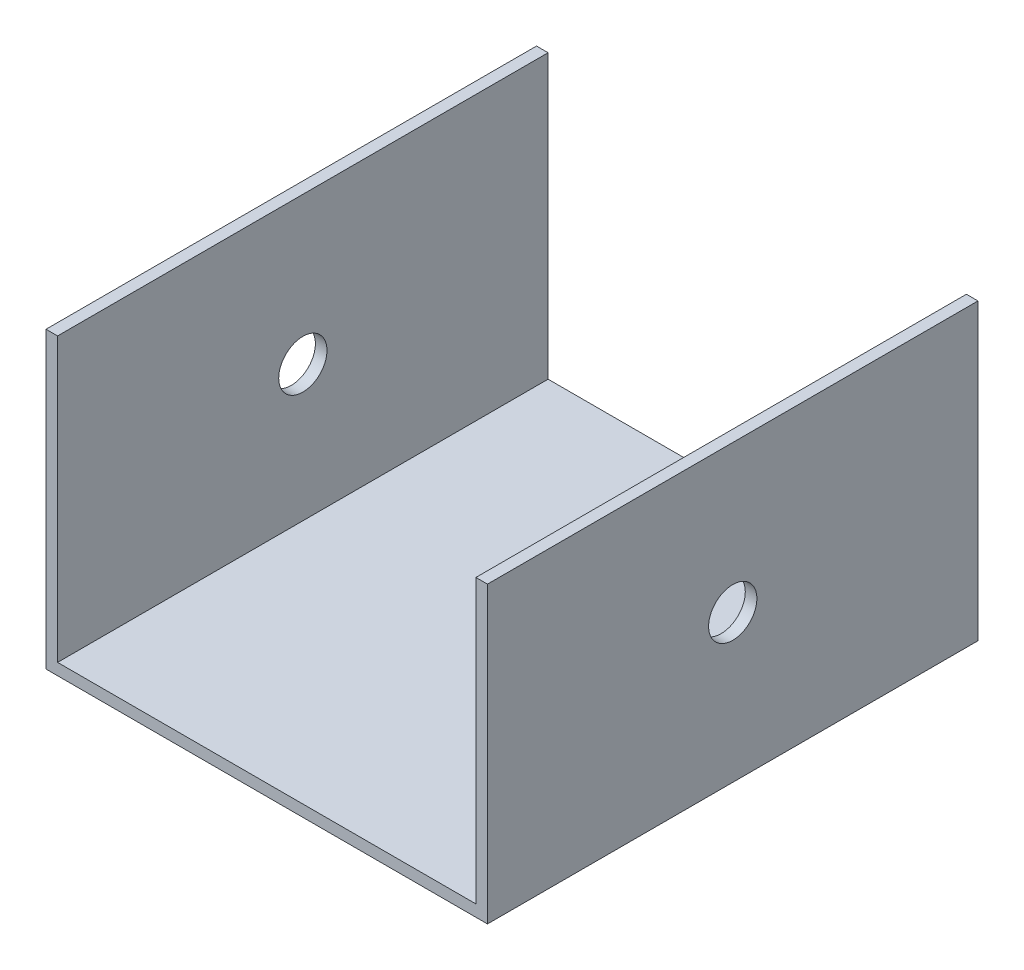
ISO-10303-21;
HEADER;
FILE_DESCRIPTION(('STEP AP214'),'2;1');
FILE_NAME('part.step','',(''),(''),'','','');
FILE_SCHEMA(('AUTOMOTIVE_DESIGN { 1 0 10303 214 1 1 1 1 }'));
ENDSEC;
DATA;
#1=APPLICATION_CONTEXT('core data for automotive mechanical design processes');
#2=APPLICATION_PROTOCOL_DEFINITION('international standard','automotive_design',2000,#1);
#3=PRODUCT_CONTEXT('',#1,'mechanical');
#4=PRODUCT('Part','Part','',(#3));
#5=PRODUCT_RELATED_PRODUCT_CATEGORY('part','',(#4));
#6=PRODUCT_DEFINITION_FORMATION('','',#4);
#7=PRODUCT_DEFINITION_CONTEXT('part definition',#1,'design');
#8=PRODUCT_DEFINITION('design','',#6,#7);
#9=PRODUCT_DEFINITION_SHAPE('','',#8);
#10=(LENGTH_UNIT() NAMED_UNIT(*) SI_UNIT(.MILLI.,.METRE.));
#11=(NAMED_UNIT(*) PLANE_ANGLE_UNIT() SI_UNIT($,.RADIAN.));
#12=(NAMED_UNIT(*) SI_UNIT($,.STERADIAN.) SOLID_ANGLE_UNIT());
#13=UNCERTAINTY_MEASURE_WITH_UNIT(LENGTH_MEASURE(1.E-05),#10,'distance_accuracy_value','');
#14=(GEOMETRIC_REPRESENTATION_CONTEXT(3) GLOBAL_UNCERTAINTY_ASSIGNED_CONTEXT((#13)) GLOBAL_UNIT_ASSIGNED_CONTEXT((#10,
#11,#12)) REPRESENTATION_CONTEXT('',''));
#15=CARTESIAN_POINT('',(0.,0.,0.));
#16=DIRECTION('',(0.,0.,1.));
#17=DIRECTION('',(1.,0.,0.));
#18=AXIS2_PLACEMENT_3D('',#15,#16,#17);
#19=CARTESIAN_POINT('',(54.15,38.1,127.));
#20=DIRECTION('',(0.,-1.,0.));
#21=DIRECTION('',(0.,0.,-1.));
#22=AXIS2_PLACEMENT_3D('',#19,#20,#21);
#23=PLANE('',#22);
#24=DIRECTION('',(-1.,0.,0.));
#25=VECTOR('',#24,1.);
#26=CARTESIAN_POINT('',(54.15,38.1,0.));
#27=LINE('',#26,#25);
#28=CARTESIAN_POINT('',(57.15,38.1,0.));
#29=VERTEX_POINT('',#28);
#30=CARTESIAN_POINT('',(54.15,38.1,0.));
#31=VERTEX_POINT('',#30);
#32=EDGE_CURVE('E140',#29,#31,#27,.T.);
#33=ORIENTED_EDGE('',*,*,#32,.T.);
#34=DIRECTION('',(0.,0.,-1.));
#35=VECTOR('',#34,1.);
#36=CARTESIAN_POINT('',(54.15,38.1,127.));
#37=LINE('',#36,#35);
#38=CARTESIAN_POINT('',(54.15,38.1,127.));
#39=VERTEX_POINT('',#38);
#40=EDGE_CURVE('E11',#39,#31,#37,.T.);
#41=ORIENTED_EDGE('',*,*,#40,.F.);
#42=DIRECTION('',(-1.,0.,0.));
#43=VECTOR('',#42,1.);
#44=CARTESIAN_POINT('',(54.15,38.1,127.));
#45=LINE('',#44,#43);
#46=CARTESIAN_POINT('',(57.15,38.1,127.));
#47=VERTEX_POINT('',#46);
#48=EDGE_CURVE('E155',#47,#39,#45,.T.);
#49=ORIENTED_EDGE('',*,*,#48,.F.);
#50=DIRECTION('',(0.,0.,-1.));
#51=VECTOR('',#50,1.);
#52=CARTESIAN_POINT('',(57.15,38.1,127.));
#53=LINE('',#52,#51);
#54=EDGE_CURVE('E136',#47,#29,#53,.T.);
#55=ORIENTED_EDGE('',*,*,#54,.T.);
#56=EDGE_LOOP('',(#33,#41,#49,#55));
#57=FACE_BOUND('',#56,.T.);
#58=ADVANCED_FACE('F44',(#57),#23,.F.);
#59=CARTESIAN_POINT('',(54.15,-35.1,127.));
#60=DIRECTION('',(1.,0.,0.));
#61=DIRECTION('',(0.,0.,-1.));
#62=AXIS2_PLACEMENT_3D('',#59,#60,#61);
#63=PLANE('',#62);
#64=CARTESIAN_POINT('',(54.15,0.,63.5));
#65=DIRECTION('',(1.,0.,0.));
#66=DIRECTION('',(0.,0.,-1.));
#67=AXIS2_PLACEMENT_3D('',#64,#65,#66);
#68=CIRCLE('',#67,6.24999999999999);
#69=CARTESIAN_POINT('',(54.15,0.,57.25));
#70=VERTEX_POINT('',#69);
#71=EDGE_CURVE('E196',#70,#70,#68,.T.);
#72=ORIENTED_EDGE('',*,*,#71,.T.);
#73=EDGE_LOOP('',(#72));
#74=FACE_BOUND('',#73,.T.);
#75=DIRECTION('',(0.,-1.,0.));
#76=VECTOR('',#75,1.);
#77=CARTESIAN_POINT('',(54.15,-35.1,0.));
#78=LINE('',#77,#76);
#79=CARTESIAN_POINT('',(54.15,-35.1,0.));
#80=VERTEX_POINT('',#79);
#81=EDGE_CURVE('E143',#31,#80,#78,.T.);
#82=ORIENTED_EDGE('',*,*,#81,.T.);
#83=DIRECTION('',(0.,0.,-1.));
#84=VECTOR('',#83,1.);
#85=CARTESIAN_POINT('',(54.15,-35.1,127.));
#86=LINE('',#85,#84);
#87=CARTESIAN_POINT('',(54.15,-35.1,127.));
#88=VERTEX_POINT('',#87);
#89=EDGE_CURVE('E52',#88,#80,#86,.T.);
#90=ORIENTED_EDGE('',*,*,#89,.F.);
#91=DIRECTION('',(0.,-1.,0.));
#92=VECTOR('',#91,1.);
#93=CARTESIAN_POINT('',(54.15,-35.1,127.));
#94=LINE('',#93,#92);
#95=EDGE_CURVE('E103',#39,#88,#94,.T.);
#96=ORIENTED_EDGE('',*,*,#95,.F.);
#97=ORIENTED_EDGE('',*,*,#40,.T.);
#98=EDGE_LOOP('',(#82,#90,#96,#97));
#99=FACE_BOUND('',#98,.T.);
#100=ADVANCED_FACE('F222',(#74,#99),#63,.F.);
#101=CARTESIAN_POINT('',(-54.15,-35.1,127.));
#102=DIRECTION('',(0.,-1.,0.));
#103=DIRECTION('',(0.,0.,-1.));
#104=AXIS2_PLACEMENT_3D('',#101,#102,#103);
#105=PLANE('',#104);
#106=CARTESIAN_POINT('',(0.,-35.1,63.5));
#107=DIRECTION('',(0.,1.,0.));
#108=DIRECTION('',(0.,0.,1.));
#109=AXIS2_PLACEMENT_3D('',#106,#107,#108);
#110=CIRCLE('',#109,6.25);
#111=CARTESIAN_POINT('',(0.,-35.1,69.75));
#112=VERTEX_POINT('',#111);
#113=EDGE_CURVE('E190',#112,#112,#110,.T.);
#114=ORIENTED_EDGE('',*,*,#113,.F.);
#115=EDGE_LOOP('',(#114));
#116=FACE_BOUND('',#115,.T.);
#117=DIRECTION('',(-1.,0.,0.));
#118=VECTOR('',#117,1.);
#119=CARTESIAN_POINT('',(-54.15,-35.1,0.));
#120=LINE('',#119,#118);
#121=CARTESIAN_POINT('',(-54.15,-35.1,0.));
#122=VERTEX_POINT('',#121);
#123=EDGE_CURVE('E146',#80,#122,#120,.T.);
#124=ORIENTED_EDGE('',*,*,#123,.T.);
#125=DIRECTION('',(0.,0.,-1.));
#126=VECTOR('',#125,1.);
#127=CARTESIAN_POINT('',(-54.15,-35.1,127.));
#128=LINE('',#127,#126);
#129=CARTESIAN_POINT('',(-54.15,-35.1,127.));
#130=VERTEX_POINT('',#129);
#131=EDGE_CURVE('E162',#130,#122,#128,.T.);
#132=ORIENTED_EDGE('',*,*,#131,.F.);
#133=DIRECTION('',(-1.,0.,0.));
#134=VECTOR('',#133,1.);
#135=CARTESIAN_POINT('',(-54.15,-35.1,127.));
#136=LINE('',#135,#134);
#137=EDGE_CURVE('E170',#88,#130,#136,.T.);
#138=ORIENTED_EDGE('',*,*,#137,.F.);
#139=ORIENTED_EDGE('',*,*,#89,.T.);
#140=EDGE_LOOP('',(#124,#132,#138,#139));
#141=FACE_BOUND('',#140,.T.);
#142=ADVANCED_FACE('F168',(#116,#141),#105,.F.);
#143=CARTESIAN_POINT('',(-54.15,-35.1,127.));
#144=DIRECTION('',(-1.,0.,0.));
#145=DIRECTION('',(0.,0.,1.));
#146=AXIS2_PLACEMENT_3D('',#143,#144,#145);
#147=PLANE('',#146);
#148=CARTESIAN_POINT('',(-54.15,0.,63.5));
#149=DIRECTION('',(-1.,0.,0.));
#150=DIRECTION('',(0.,0.,1.));
#151=AXIS2_PLACEMENT_3D('',#148,#149,#150);
#152=CIRCLE('',#151,6.24999999999999);
#153=CARTESIAN_POINT('',(-54.15,0.,69.75));
#154=VERTEX_POINT('',#153);
#155=EDGE_CURVE('E193',#154,#154,#152,.T.);
#156=ORIENTED_EDGE('',*,*,#155,.T.);
#157=EDGE_LOOP('',(#156));
#158=FACE_BOUND('',#157,.T.);
#159=DIRECTION('',(0.,1.,0.));
#160=VECTOR('',#159,1.);
#161=CARTESIAN_POINT('',(-54.15,-35.1,0.));
#162=LINE('',#161,#160);
#163=CARTESIAN_POINT('',(-54.15,38.1,0.));
#164=VERTEX_POINT('',#163);
#165=EDGE_CURVE('E148',#122,#164,#162,.T.);
#166=ORIENTED_EDGE('',*,*,#165,.T.);
#167=DIRECTION('',(0.,0.,-1.));
#168=VECTOR('',#167,1.);
#169=CARTESIAN_POINT('',(-54.15,38.1,127.));
#170=LINE('',#169,#168);
#171=CARTESIAN_POINT('',(-54.15,38.1,127.));
#172=VERTEX_POINT('',#171);
#173=EDGE_CURVE('E159',#172,#164,#170,.T.);
#174=ORIENTED_EDGE('',*,*,#173,.F.);
#175=DIRECTION('',(0.,1.,0.));
#176=VECTOR('',#175,1.);
#177=CARTESIAN_POINT('',(-54.15,-35.1,127.));
#178=LINE('',#177,#176);
#179=EDGE_CURVE('E182',#130,#172,#178,.T.);
#180=ORIENTED_EDGE('',*,*,#179,.F.);
#181=ORIENTED_EDGE('',*,*,#131,.T.);
#182=EDGE_LOOP('',(#166,#174,#180,#181));
#183=FACE_BOUND('',#182,.T.);
#184=ADVANCED_FACE('F178',(#158,#183),#147,.F.);
#185=CARTESIAN_POINT('',(-57.15,38.1,127.));
#186=DIRECTION('',(0.,-1.,0.));
#187=DIRECTION('',(0.,0.,-1.));
#188=AXIS2_PLACEMENT_3D('',#185,#186,#187);
#189=PLANE('',#188);
#190=DIRECTION('',(-1.,0.,0.));
#191=VECTOR('',#190,1.);
#192=CARTESIAN_POINT('',(-57.15,38.1,0.));
#193=LINE('',#192,#191);
#194=CARTESIAN_POINT('',(-57.15,38.1,0.));
#195=VERTEX_POINT('',#194);
#196=EDGE_CURVE('E150',#164,#195,#193,.T.);
#197=ORIENTED_EDGE('',*,*,#196,.T.);
#198=DIRECTION('',(0.,0.,-1.));
#199=VECTOR('',#198,1.);
#200=CARTESIAN_POINT('',(-57.15,38.1,127.));
#201=LINE('',#200,#199);
#202=CARTESIAN_POINT('',(-57.15,38.1,127.));
#203=VERTEX_POINT('',#202);
#204=EDGE_CURVE('E131',#203,#195,#201,.T.);
#205=ORIENTED_EDGE('',*,*,#204,.F.);
#206=DIRECTION('',(-1.,0.,0.));
#207=VECTOR('',#206,1.);
#208=CARTESIAN_POINT('',(-57.15,38.1,127.));
#209=LINE('',#208,#207);
#210=EDGE_CURVE('E122',#172,#203,#209,.T.);
#211=ORIENTED_EDGE('',*,*,#210,.F.);
#212=ORIENTED_EDGE('',*,*,#173,.T.);
#213=EDGE_LOOP('',(#197,#205,#211,#212));
#214=FACE_BOUND('',#213,.T.);
#215=ADVANCED_FACE('F181',(#214),#189,.F.);
#216=CARTESIAN_POINT('',(-57.15,-38.1,127.));
#217=DIRECTION('',(1.,0.,0.));
#218=DIRECTION('',(0.,0.,-1.));
#219=AXIS2_PLACEMENT_3D('',#216,#217,#218);
#220=PLANE('',#219);
#221=CARTESIAN_POINT('',(-57.15,0.,63.5));
#222=DIRECTION('',(-1.,0.,0.));
#223=DIRECTION('',(0.,0.,1.));
#224=AXIS2_PLACEMENT_3D('',#221,#222,#223);
#225=CIRCLE('',#224,6.24999999999999);
#226=CARTESIAN_POINT('',(-57.15,0.,69.75));
#227=VERTEX_POINT('',#226);
#228=EDGE_CURVE('E202',#227,#227,#225,.T.);
#229=ORIENTED_EDGE('',*,*,#228,.F.);
#230=EDGE_LOOP('',(#229));
#231=FACE_BOUND('',#230,.T.);
#232=DIRECTION('',(0.,-1.,0.));
#233=VECTOR('',#232,1.);
#234=CARTESIAN_POINT('',(-57.15,-38.1,0.));
#235=LINE('',#234,#233);
#236=CARTESIAN_POINT('',(-57.15,-38.1,0.));
#237=VERTEX_POINT('',#236);
#238=EDGE_CURVE('E130',#195,#237,#235,.T.);
#239=ORIENTED_EDGE('',*,*,#238,.T.);
#240=DIRECTION('',(0.,0.,-1.));
#241=VECTOR('',#240,1.);
#242=CARTESIAN_POINT('',(-57.15,-38.1,127.));
#243=LINE('',#242,#241);
#244=CARTESIAN_POINT('',(-57.15,-38.1,127.));
#245=VERTEX_POINT('',#244);
#246=EDGE_CURVE('E127',#245,#237,#243,.T.);
#247=ORIENTED_EDGE('',*,*,#246,.F.);
#248=DIRECTION('',(0.,-1.,0.));
#249=VECTOR('',#248,1.);
#250=CARTESIAN_POINT('',(-57.15,-38.1,127.));
#251=LINE('',#250,#249);
#252=EDGE_CURVE('E116',#203,#245,#251,.T.);
#253=ORIENTED_EDGE('',*,*,#252,.F.);
#254=ORIENTED_EDGE('',*,*,#204,.T.);
#255=EDGE_LOOP('',(#239,#247,#253,#254));
#256=FACE_BOUND('',#255,.T.);
#257=ADVANCED_FACE('F128',(#231,#256),#220,.F.);
#258=CARTESIAN_POINT('',(-57.15,-38.1,127.));
#259=DIRECTION('',(0.,1.,0.));
#260=DIRECTION('',(0.,0.,1.));
#261=AXIS2_PLACEMENT_3D('',#258,#259,#260);
#262=PLANE('',#261);
#263=CARTESIAN_POINT('',(0.,-38.1,63.5));
#264=DIRECTION('',(0.,1.,0.));
#265=DIRECTION('',(0.,0.,1.));
#266=AXIS2_PLACEMENT_3D('',#263,#264,#265);
#267=CIRCLE('',#266,6.25);
#268=CARTESIAN_POINT('',(0.,-38.1,69.75));
#269=VERTEX_POINT('',#268);
#270=EDGE_CURVE('E144',#269,#269,#267,.T.);
#271=ORIENTED_EDGE('',*,*,#270,.T.);
#272=EDGE_LOOP('',(#271));
#273=FACE_BOUND('',#272,.T.);
#274=DIRECTION('',(1.,0.,0.));
#275=VECTOR('',#274,1.);
#276=CARTESIAN_POINT('',(-57.15,-38.1,0.));
#277=LINE('',#276,#275);
#278=CARTESIAN_POINT('',(57.15,-38.1,0.));
#279=VERTEX_POINT('',#278);
#280=EDGE_CURVE('E89',#237,#279,#277,.T.);
#281=ORIENTED_EDGE('',*,*,#280,.T.);
#282=DIRECTION('',(0.,0.,-1.));
#283=VECTOR('',#282,1.);
#284=CARTESIAN_POINT('',(57.15,-38.1,127.));
#285=LINE('',#284,#283);
#286=CARTESIAN_POINT('',(57.15,-38.1,127.));
#287=VERTEX_POINT('',#286);
#288=EDGE_CURVE('E132',#287,#279,#285,.T.);
#289=ORIENTED_EDGE('',*,*,#288,.F.);
#290=DIRECTION('',(1.,0.,0.));
#291=VECTOR('',#290,1.);
#292=CARTESIAN_POINT('',(-57.15,-38.1,127.));
#293=LINE('',#292,#291);
#294=EDGE_CURVE('E120',#245,#287,#293,.T.);
#295=ORIENTED_EDGE('',*,*,#294,.F.);
#296=ORIENTED_EDGE('',*,*,#246,.T.);
#297=EDGE_LOOP('',(#281,#289,#295,#296));
#298=FACE_BOUND('',#297,.T.);
#299=ADVANCED_FACE('F134',(#273,#298),#262,.F.);
#300=CARTESIAN_POINT('',(57.15,-38.1,127.));
#301=DIRECTION('',(-1.,0.,0.));
#302=DIRECTION('',(0.,0.,1.));
#303=AXIS2_PLACEMENT_3D('',#300,#301,#302);
#304=PLANE('',#303);
#305=CARTESIAN_POINT('',(57.15,0.,63.5));
#306=DIRECTION('',(-1.,0.,0.));
#307=DIRECTION('',(0.,0.,1.));
#308=AXIS2_PLACEMENT_3D('',#305,#306,#307);
#309=CIRCLE('',#308,6.24999999999999);
#310=CARTESIAN_POINT('',(57.15,0.,69.75));
#311=VERTEX_POINT('',#310);
#312=EDGE_CURVE('E199',#311,#311,#309,.T.);
#313=ORIENTED_EDGE('',*,*,#312,.T.);
#314=EDGE_LOOP('',(#313));
#315=FACE_BOUND('',#314,.T.);
#316=DIRECTION('',(0.,1.,0.));
#317=VECTOR('',#316,1.);
#318=CARTESIAN_POINT('',(57.15,-38.1,0.));
#319=LINE('',#318,#317);
#320=EDGE_CURVE('E95',#279,#29,#319,.T.);
#321=ORIENTED_EDGE('',*,*,#320,.T.);
#322=ORIENTED_EDGE('',*,*,#54,.F.);
#323=DIRECTION('',(0.,1.,0.));
#324=VECTOR('',#323,1.);
#325=CARTESIAN_POINT('',(57.15,-38.1,127.));
#326=LINE('',#325,#324);
#327=EDGE_CURVE('E60',#287,#47,#326,.T.);
#328=ORIENTED_EDGE('',*,*,#327,.F.);
#329=ORIENTED_EDGE('',*,*,#288,.T.);
#330=EDGE_LOOP('',(#321,#322,#328,#329));
#331=FACE_BOUND('',#330,.T.);
#332=ADVANCED_FACE('F216',(#315,#331),#304,.F.);
#333=CARTESIAN_POINT('',(0.,0.,127.));
#334=DIRECTION('',(0.,0.,1.));
#335=DIRECTION('',(1.,0.,0.));
#336=AXIS2_PLACEMENT_3D('',#333,#334,#335);
#337=PLANE('',#336);
#338=ORIENTED_EDGE('',*,*,#48,.T.);
#339=ORIENTED_EDGE('',*,*,#95,.T.);
#340=ORIENTED_EDGE('',*,*,#137,.T.);
#341=ORIENTED_EDGE('',*,*,#179,.T.);
#342=ORIENTED_EDGE('',*,*,#210,.T.);
#343=ORIENTED_EDGE('',*,*,#252,.T.);
#344=ORIENTED_EDGE('',*,*,#294,.T.);
#345=ORIENTED_EDGE('',*,*,#327,.T.);
#346=EDGE_LOOP('',(#338,#339,#340,#341,#342,#343,#344,#345));
#347=FACE_BOUND('',#346,.T.);
#348=ADVANCED_FACE('F118',(#347),#337,.T.);
#349=CARTESIAN_POINT('',(0.,0.,0.));
#350=DIRECTION('',(0.,0.,1.));
#351=DIRECTION('',(1.,0.,0.));
#352=AXIS2_PLACEMENT_3D('',#349,#350,#351);
#353=PLANE('',#352);
#354=ORIENTED_EDGE('',*,*,#32,.F.);
#355=ORIENTED_EDGE('',*,*,#320,.F.);
#356=ORIENTED_EDGE('',*,*,#280,.F.);
#357=ORIENTED_EDGE('',*,*,#238,.F.);
#358=ORIENTED_EDGE('',*,*,#196,.F.);
#359=ORIENTED_EDGE('',*,*,#165,.F.);
#360=ORIENTED_EDGE('',*,*,#123,.F.);
#361=ORIENTED_EDGE('',*,*,#81,.F.);
#362=EDGE_LOOP('',(#354,#355,#356,#357,#358,#359,#360,#361));
#363=FACE_BOUND('',#362,.T.);
#364=ADVANCED_FACE('F174',(#363),#353,.F.);
#365=CARTESIAN_POINT('',(0.,-35.1,63.5));
#366=DIRECTION('',(0.,1.,0.));
#367=DIRECTION('',(0.,0.,1.));
#368=AXIS2_PLACEMENT_3D('',#365,#366,#367);
#369=CYLINDRICAL_SURFACE('',#368,6.25);
#370=ORIENTED_EDGE('',*,*,#270,.F.);
#371=EDGE_LOOP('',(#370));
#372=FACE_BOUND('',#371,.T.);
#373=ORIENTED_EDGE('',*,*,#113,.T.);
#374=EDGE_LOOP('',(#373));
#375=FACE_BOUND('',#374,.T.);
#376=ADVANCED_FACE('F239',(#372,#375),#369,.F.);
#377=CARTESIAN_POINT('',(-57.15,0.,63.5));
#378=DIRECTION('',(-1.,0.,0.));
#379=DIRECTION('',(0.,0.,1.));
#380=AXIS2_PLACEMENT_3D('',#377,#378,#379);
#381=CYLINDRICAL_SURFACE('',#380,6.24999999999999);
#382=ORIENTED_EDGE('',*,*,#228,.T.);
#383=EDGE_LOOP('',(#382));
#384=FACE_BOUND('',#383,.T.);
#385=ORIENTED_EDGE('',*,*,#155,.F.);
#386=EDGE_LOOP('',(#385));
#387=FACE_BOUND('',#386,.T.);
#388=ADVANCED_FACE('F206',(#384,#387),#381,.F.);
#389=ORIENTED_EDGE('',*,*,#312,.F.);
#390=EDGE_LOOP('',(#389));
#391=FACE_BOUND('',#390,.T.);
#392=ORIENTED_EDGE('',*,*,#71,.F.);
#393=EDGE_LOOP('',(#392));
#394=FACE_BOUND('',#393,.T.);
#395=ADVANCED_FACE('F244',(#391,#394),#381,.F.);
#396=CLOSED_SHELL('',(#58,#100,#142,#184,#215,#257,#299,#332,#348,#364,#376,#388,#395));
#397=MANIFOLD_SOLID_BREP('B2',#396);
#398=ADVANCED_BREP_SHAPE_REPRESENTATION('',(#18,#397),#14);
#399=SHAPE_DEFINITION_REPRESENTATION(#9,#398);
ENDSEC;
END-ISO-10303-21;
